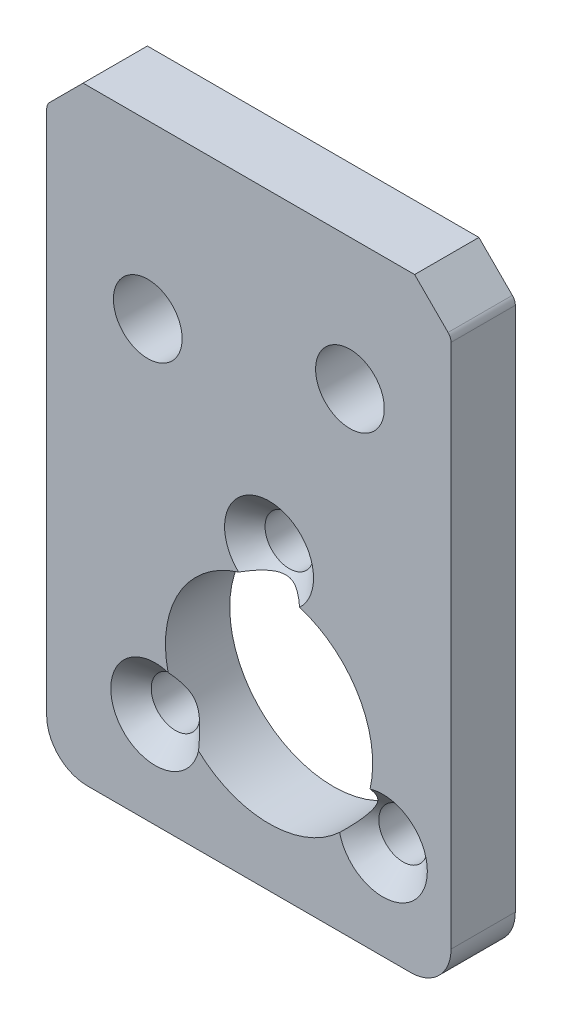
ISO-10303-21;
HEADER;
FILE_DESCRIPTION(('STEP AP214'),'2;1');
FILE_NAME('part.step','',(''),(''),'','','');
FILE_SCHEMA(('AUTOMOTIVE_DESIGN { 1 0 10303 214 1 1 1 1 }'));
ENDSEC;
DATA;
#1=APPLICATION_CONTEXT('core data for automotive mechanical design processes');
#2=APPLICATION_PROTOCOL_DEFINITION('international standard','automotive_design',2000,#1);
#3=PRODUCT_CONTEXT('',#1,'mechanical');
#4=PRODUCT('Part','Part','',(#3));
#5=PRODUCT_RELATED_PRODUCT_CATEGORY('part','',(#4));
#6=PRODUCT_DEFINITION_FORMATION('','',#4);
#7=PRODUCT_DEFINITION_CONTEXT('part definition',#1,'design');
#8=PRODUCT_DEFINITION('design','',#6,#7);
#9=PRODUCT_DEFINITION_SHAPE('','',#8);
#10=(LENGTH_UNIT() NAMED_UNIT(*) SI_UNIT(.MILLI.,.METRE.));
#11=(NAMED_UNIT(*) PLANE_ANGLE_UNIT() SI_UNIT($,.RADIAN.));
#12=(NAMED_UNIT(*) SI_UNIT($,.STERADIAN.) SOLID_ANGLE_UNIT());
#13=UNCERTAINTY_MEASURE_WITH_UNIT(LENGTH_MEASURE(1.E-05),#10,'distance_accuracy_value','');
#14=(GEOMETRIC_REPRESENTATION_CONTEXT(3) GLOBAL_UNCERTAINTY_ASSIGNED_CONTEXT((#13)) GLOBAL_UNIT_ASSIGNED_CONTEXT((#10,
#11,#12)) REPRESENTATION_CONTEXT('',''));
#15=CARTESIAN_POINT('',(0.,0.,0.));
#16=DIRECTION('',(0.,0.,1.));
#17=DIRECTION('',(1.,0.,0.));
#18=AXIS2_PLACEMENT_3D('',#15,#16,#17);
#19=CARTESIAN_POINT('',(0.,0.,3.18));
#20=DIRECTION('',(0.,0.,-1.));
#21=DIRECTION('',(-1.,0.,0.));
#22=AXIS2_PLACEMENT_3D('',#19,#20,#21);
#23=PLANE('',#22);
#24=DIRECTION('',(0.,-1.,0.));
#25=VECTOR('',#24,1.);
#26=CARTESIAN_POINT('',(-20.,-30.,3.18));
#27=LINE('',#26,#25);
#28=CARTESIAN_POINT('',(-20.,-2.00710678118655,3.18));
#29=VERTEX_POINT('',#28);
#30=CARTESIAN_POINT('',(-20.,-28.,3.18));
#31=VERTEX_POINT('',#30);
#32=EDGE_CURVE('E205',#29,#31,#27,.T.);
#33=ORIENTED_EDGE('',*,*,#32,.T.);
#34=CARTESIAN_POINT('',(-18.,-28.,3.18));
#35=DIRECTION('',(0.,0.,-1.));
#36=DIRECTION('',(-1.,0.,0.));
#37=AXIS2_PLACEMENT_3D('',#34,#35,#36);
#38=CIRCLE('',#37,2.);
#39=CARTESIAN_POINT('',(-18.,-30.,3.18));
#40=VERTEX_POINT('',#39);
#41=EDGE_CURVE('E54',#31,#40,#38,.F.);
#42=ORIENTED_EDGE('',*,*,#41,.T.);
#43=DIRECTION('',(1.,0.,0.));
#44=VECTOR('',#43,1.);
#45=CARTESIAN_POINT('',(-20.,-30.,3.18));
#46=LINE('',#45,#44);
#47=CARTESIAN_POINT('',(-2.,-30.,3.18));
#48=VERTEX_POINT('',#47);
#49=EDGE_CURVE('E208',#40,#48,#46,.T.);
#50=ORIENTED_EDGE('',*,*,#49,.T.);
#51=CARTESIAN_POINT('',(-2.,-28.,3.18));
#52=DIRECTION('',(0.,0.,-1.));
#53=DIRECTION('',(-1.,0.,0.));
#54=AXIS2_PLACEMENT_3D('',#51,#52,#53);
#55=CIRCLE('',#54,2.);
#56=CARTESIAN_POINT('',(0.,-28.,3.18));
#57=VERTEX_POINT('',#56);
#58=EDGE_CURVE('E61',#48,#57,#55,.F.);
#59=ORIENTED_EDGE('',*,*,#58,.T.);
#60=DIRECTION('',(0.,1.,0.));
#61=VECTOR('',#60,1.);
#62=CARTESIAN_POINT('',(0.,-30.,3.18));
#63=LINE('',#62,#61);
#64=CARTESIAN_POINT('',(0.,-2.00710678118655,3.18));
#65=VERTEX_POINT('',#64);
#66=EDGE_CURVE('E212',#57,#65,#63,.T.);
#67=ORIENTED_EDGE('',*,*,#66,.T.);
#68=CARTESIAN_POINT('',(-0.5,-2.00710678118655,3.18));
#69=DIRECTION('',(0.,0.,-1.));
#70=DIRECTION('',(-1.,0.,0.));
#71=AXIS2_PLACEMENT_3D('',#68,#69,#70);
#72=CIRCLE('',#71,0.5);
#73=CARTESIAN_POINT('',(-0.146446609406726,-1.65355339059328,3.18));
#74=VERTEX_POINT('',#73);
#75=EDGE_CURVE('E349',#65,#74,#72,.F.);
#76=ORIENTED_EDGE('',*,*,#75,.T.);
#77=DIRECTION('',(0.707106781186548,-0.707106781186548,0.));
#78=VECTOR('',#77,1.);
#79=CARTESIAN_POINT('',(-1.8,0.,3.18));
#80=LINE('',#79,#78);
#81=CARTESIAN_POINT('',(-1.8,0.,3.18));
#82=VERTEX_POINT('',#81);
#83=EDGE_CURVE('E370',#74,#82,#80,.F.);
#84=ORIENTED_EDGE('',*,*,#83,.T.);
#85=DIRECTION('',(-1.,0.,0.));
#86=VECTOR('',#85,1.);
#87=CARTESIAN_POINT('',(-20.,0.,3.18));
#88=LINE('',#87,#86);
#89=CARTESIAN_POINT('',(-18.2,0.,3.18));
#90=VERTEX_POINT('',#89);
#91=EDGE_CURVE('E215',#82,#90,#88,.T.);
#92=ORIENTED_EDGE('',*,*,#91,.T.);
#93=DIRECTION('',(0.707106781186546,0.707106781186549,0.));
#94=VECTOR('',#93,1.);
#95=CARTESIAN_POINT('',(-20.,-1.80000000000001,3.18));
#96=LINE('',#95,#94);
#97=CARTESIAN_POINT('',(-19.8535533905933,-1.65355339059328,3.18));
#98=VERTEX_POINT('',#97);
#99=EDGE_CURVE('E366',#90,#98,#96,.F.);
#100=ORIENTED_EDGE('',*,*,#99,.T.);
#101=CARTESIAN_POINT('',(-19.5,-2.00710678118655,3.18));
#102=DIRECTION('',(0.,0.,-1.));
#103=DIRECTION('',(-1.,0.,0.));
#104=AXIS2_PLACEMENT_3D('',#101,#102,#103);
#105=CIRCLE('',#104,0.5);
#106=EDGE_CURVE('E346',#98,#29,#105,.F.);
#107=ORIENTED_EDGE('',*,*,#106,.T.);
#108=EDGE_LOOP('',(#33,#42,#50,#59,#67,#76,#84,#92,#100,#107));
#109=FACE_BOUND('',#108,.T.);
#110=CARTESIAN_POINT('',(-5.,-6.5,3.18));
#111=DIRECTION('',(0.,0.,1.));
#112=DIRECTION('',(1.,0.,0.));
#113=AXIS2_PLACEMENT_3D('',#110,#111,#112);
#114=CIRCLE('',#113,1.7);
#115=CARTESIAN_POINT('',(-6.7,-6.5,3.18));
#116=VERTEX_POINT('',#115);
#117=EDGE_CURVE('E197',#116,#116,#114,.T.);
#118=ORIENTED_EDGE('',*,*,#117,.F.);
#119=EDGE_LOOP('',(#118));
#120=FACE_BOUND('',#119,.T.);
#121=CARTESIAN_POINT('',(-15.,-8.5,3.18));
#122=DIRECTION('',(0.,0.,1.));
#123=DIRECTION('',(1.,0.,0.));
#124=AXIS2_PLACEMENT_3D('',#121,#122,#123);
#125=CIRCLE('',#124,1.7);
#126=CARTESIAN_POINT('',(-16.7,-8.5,3.18));
#127=VERTEX_POINT('',#126);
#128=EDGE_CURVE('E176',#127,#127,#125,.T.);
#129=ORIENTED_EDGE('',*,*,#128,.F.);
#130=EDGE_LOOP('',(#129));
#131=FACE_BOUND('',#130,.T.);
#132=CARTESIAN_POINT('',(-9.,-22.,3.18));
#133=DIRECTION('',(0.,0.,1.));
#134=DIRECTION('',(1.,0.,0.));
#135=AXIS2_PLACEMENT_3D('',#132,#133,#134);
#136=CIRCLE('',#135,5.125);
#137=CARTESIAN_POINT('',(-10.5079776140165,-17.101875,3.18));
#138=VERTEX_POINT('',#137);
#139=CARTESIAN_POINT('',(-13.9958894879199,-23.1431155779234,3.18));
#140=VERTEX_POINT('',#139);
#141=EDGE_CURVE('E160',#138,#140,#136,.T.);
#142=ORIENTED_EDGE('',*,*,#141,.F.);
#143=CARTESIAN_POINT('',(-9.,-15.5,3.18));
#144=DIRECTION('',(0.,0.,1.));
#145=DIRECTION('',(1.,0.,0.));
#146=AXIS2_PLACEMENT_3D('',#143,#144,#145);
#147=CIRCLE('',#146,2.2);
#148=CARTESIAN_POINT('',(-7.49202238598347,-17.101875,3.18));
#149=VERTEX_POINT('',#148);
#150=EDGE_CURVE('E147',#149,#138,#147,.T.);
#151=ORIENTED_EDGE('',*,*,#150,.F.);
#152=CARTESIAN_POINT('',(-4.00411051208008,-23.1431155779234,3.18));
#153=VERTEX_POINT('',#152);
#154=EDGE_CURVE('E158',#153,#149,#136,.T.);
#155=ORIENTED_EDGE('',*,*,#154,.F.);
#156=CARTESIAN_POINT('',(-3.37083487540115,-25.25,3.18));
#157=DIRECTION('',(0.,0.,1.));
#158=DIRECTION('',(1.,0.,0.));
#159=AXIS2_PLACEMENT_3D('',#156,#157,#158);
#160=CIRCLE('',#159,2.2);
#161=CARTESIAN_POINT('',(-5.51208812609661,-25.7550094220766,3.18));
#162=VERTEX_POINT('',#161);
#163=EDGE_CURVE('E417',#162,#153,#160,.T.);
#164=ORIENTED_EDGE('',*,*,#163,.F.);
#165=CARTESIAN_POINT('',(-12.4879118739034,-25.7550094220766,3.18));
#166=VERTEX_POINT('',#165);
#167=EDGE_CURVE('E172',#166,#162,#136,.T.);
#168=ORIENTED_EDGE('',*,*,#167,.F.);
#169=CARTESIAN_POINT('',(-14.6291651245988,-25.25,3.18));
#170=DIRECTION('',(0.,0.,1.));
#171=DIRECTION('',(1.,0.,0.));
#172=AXIS2_PLACEMENT_3D('',#169,#170,#171);
#173=CIRCLE('',#172,2.2);
#174=EDGE_CURVE('E412',#140,#166,#173,.T.);
#175=ORIENTED_EDGE('',*,*,#174,.F.);
#176=EDGE_LOOP('',(#142,#151,#155,#164,#168,#175));
#177=FACE_BOUND('',#176,.T.);
#178=ADVANCED_FACE('F45',(#109,#120,#131,#177),#23,.F.);
#179=CARTESIAN_POINT('',(0.,0.,0.));
#180=DIRECTION('',(0.,0.,-1.));
#181=DIRECTION('',(-1.,0.,0.));
#182=AXIS2_PLACEMENT_3D('',#179,#180,#181);
#183=PLANE('',#182);
#184=CARTESIAN_POINT('',(-9.,-15.5,0.));
#185=DIRECTION('',(0.,0.,1.));
#186=DIRECTION('',(1.,0.,0.));
#187=AXIS2_PLACEMENT_3D('',#184,#185,#186);
#188=CIRCLE('',#187,1.2);
#189=CARTESIAN_POINT('',(-7.8,-15.5,0.));
#190=VERTEX_POINT('',#189);
#191=EDGE_CURVE('E419',#190,#190,#188,.T.);
#192=ORIENTED_EDGE('',*,*,#191,.T.);
#193=EDGE_LOOP('',(#192));
#194=FACE_BOUND('',#193,.T.);
#195=CARTESIAN_POINT('',(-14.6291651245988,-25.25,0.));
#196=DIRECTION('',(0.,0.,1.));
#197=DIRECTION('',(1.,0.,0.));
#198=AXIS2_PLACEMENT_3D('',#195,#196,#197);
#199=CIRCLE('',#198,1.2);
#200=CARTESIAN_POINT('',(-13.4291651245988,-25.25,0.));
#201=VERTEX_POINT('',#200);
#202=EDGE_CURVE('E411',#201,#201,#199,.T.);
#203=ORIENTED_EDGE('',*,*,#202,.T.);
#204=EDGE_LOOP('',(#203));
#205=FACE_BOUND('',#204,.T.);
#206=CARTESIAN_POINT('',(-3.37083487540115,-25.25,0.));
#207=DIRECTION('',(0.,0.,1.));
#208=DIRECTION('',(1.,0.,0.));
#209=AXIS2_PLACEMENT_3D('',#206,#207,#208);
#210=CIRCLE('',#209,1.2);
#211=CARTESIAN_POINT('',(-2.17083487540115,-25.25,0.));
#212=VERTEX_POINT('',#211);
#213=EDGE_CURVE('E186',#212,#212,#210,.T.);
#214=ORIENTED_EDGE('',*,*,#213,.T.);
#215=EDGE_LOOP('',(#214));
#216=FACE_BOUND('',#215,.T.);
#217=CARTESIAN_POINT('',(-15.,-8.5,0.));
#218=DIRECTION('',(0.,0.,1.));
#219=DIRECTION('',(1.,0.,0.));
#220=AXIS2_PLACEMENT_3D('',#217,#218,#219);
#221=CIRCLE('',#220,1.7);
#222=CARTESIAN_POINT('',(-16.7,-8.5,0.));
#223=VERTEX_POINT('',#222);
#224=EDGE_CURVE('E170',#223,#223,#221,.T.);
#225=ORIENTED_EDGE('',*,*,#224,.T.);
#226=EDGE_LOOP('',(#225));
#227=FACE_BOUND('',#226,.T.);
#228=DIRECTION('',(1.,0.,0.));
#229=VECTOR('',#228,1.);
#230=CARTESIAN_POINT('',(-20.,-30.,0.));
#231=LINE('',#230,#229);
#232=CARTESIAN_POINT('',(-18.,-30.,0.));
#233=VERTEX_POINT('',#232);
#234=CARTESIAN_POINT('',(-2.,-30.,0.));
#235=VERTEX_POINT('',#234);
#236=EDGE_CURVE('E221',#233,#235,#231,.T.);
#237=ORIENTED_EDGE('',*,*,#236,.F.);
#238=CARTESIAN_POINT('',(-18.,-28.,0.));
#239=DIRECTION('',(0.,0.,-1.));
#240=DIRECTION('',(-1.,0.,0.));
#241=AXIS2_PLACEMENT_3D('',#238,#239,#240);
#242=CIRCLE('',#241,2.);
#243=CARTESIAN_POINT('',(-20.,-28.,0.));
#244=VERTEX_POINT('',#243);
#245=EDGE_CURVE('E328',#233,#244,#242,.T.);
#246=ORIENTED_EDGE('',*,*,#245,.T.);
#247=DIRECTION('',(0.,-1.,0.));
#248=VECTOR('',#247,1.);
#249=CARTESIAN_POINT('',(-20.,-30.,0.));
#250=LINE('',#249,#248);
#251=CARTESIAN_POINT('',(-20.,-2.00710678118655,0.));
#252=VERTEX_POINT('',#251);
#253=EDGE_CURVE('E201',#252,#244,#250,.T.);
#254=ORIENTED_EDGE('',*,*,#253,.F.);
#255=CARTESIAN_POINT('',(-19.5,-2.00710678118655,0.));
#256=DIRECTION('',(0.,0.,-1.));
#257=DIRECTION('',(-1.,0.,0.));
#258=AXIS2_PLACEMENT_3D('',#255,#256,#257);
#259=CIRCLE('',#258,0.5);
#260=CARTESIAN_POINT('',(-19.8535533905933,-1.65355339059328,0.));
#261=VERTEX_POINT('',#260);
#262=EDGE_CURVE('E355',#252,#261,#259,.T.);
#263=ORIENTED_EDGE('',*,*,#262,.T.);
#264=DIRECTION('',(-0.707106781186546,-0.707106781186549,0.));
#265=VECTOR('',#264,1.);
#266=CARTESIAN_POINT('',(-9.10000000000004,9.1,0.));
#267=LINE('',#266,#265);
#268=CARTESIAN_POINT('',(-18.2,0.,0.));
#269=VERTEX_POINT('',#268);
#270=EDGE_CURVE('E380',#261,#269,#267,.F.);
#271=ORIENTED_EDGE('',*,*,#270,.T.);
#272=DIRECTION('',(-1.,0.,0.));
#273=VECTOR('',#272,1.);
#274=CARTESIAN_POINT('',(-20.,0.,0.));
#275=LINE('',#274,#273);
#276=CARTESIAN_POINT('',(-1.8,0.,0.));
#277=VERTEX_POINT('',#276);
#278=EDGE_CURVE('E209',#277,#269,#275,.T.);
#279=ORIENTED_EDGE('',*,*,#278,.F.);
#280=DIRECTION('',(-0.707106781186548,0.707106781186548,0.));
#281=VECTOR('',#280,1.);
#282=CARTESIAN_POINT('',(-0.900000000000001,-0.900000000000001,0.));
#283=LINE('',#282,#281);
#284=CARTESIAN_POINT('',(-0.146446609406726,-1.65355339059328,0.));
#285=VERTEX_POINT('',#284);
#286=EDGE_CURVE('E152',#277,#285,#283,.F.);
#287=ORIENTED_EDGE('',*,*,#286,.T.);
#288=CARTESIAN_POINT('',(-0.5,-2.00710678118655,0.));
#289=DIRECTION('',(0.,0.,-1.));
#290=DIRECTION('',(-1.,0.,0.));
#291=AXIS2_PLACEMENT_3D('',#288,#289,#290);
#292=CIRCLE('',#291,0.5);
#293=CARTESIAN_POINT('',(0.,-2.00710678118655,0.));
#294=VERTEX_POINT('',#293);
#295=EDGE_CURVE('E358',#285,#294,#292,.T.);
#296=ORIENTED_EDGE('',*,*,#295,.T.);
#297=DIRECTION('',(0.,1.,0.));
#298=VECTOR('',#297,1.);
#299=CARTESIAN_POINT('',(0.,-30.,0.));
#300=LINE('',#299,#298);
#301=CARTESIAN_POINT('',(0.,-28.,0.));
#302=VERTEX_POINT('',#301);
#303=EDGE_CURVE('E225',#302,#294,#300,.T.);
#304=ORIENTED_EDGE('',*,*,#303,.F.);
#305=CARTESIAN_POINT('',(-2.,-28.,0.));
#306=DIRECTION('',(0.,0.,-1.));
#307=DIRECTION('',(-1.,0.,0.));
#308=AXIS2_PLACEMENT_3D('',#305,#306,#307);
#309=CIRCLE('',#308,2.);
#310=EDGE_CURVE('E331',#302,#235,#309,.T.);
#311=ORIENTED_EDGE('',*,*,#310,.T.);
#312=EDGE_LOOP('',(#237,#246,#254,#263,#271,#279,#287,#296,#304,#311));
#313=FACE_BOUND('',#312,.T.);
#314=CARTESIAN_POINT('',(-5.,-6.5,0.));
#315=DIRECTION('',(0.,0.,1.));
#316=DIRECTION('',(1.,0.,0.));
#317=AXIS2_PLACEMENT_3D('',#314,#315,#316);
#318=CIRCLE('',#317,1.7);
#319=CARTESIAN_POINT('',(-6.7,-6.5,0.));
#320=VERTEX_POINT('',#319);
#321=EDGE_CURVE('E195',#320,#320,#318,.T.);
#322=ORIENTED_EDGE('',*,*,#321,.T.);
#323=EDGE_LOOP('',(#322));
#324=FACE_BOUND('',#323,.T.);
#325=CARTESIAN_POINT('',(-9.,-22.,0.));
#326=DIRECTION('',(0.,0.,1.));
#327=DIRECTION('',(1.,0.,0.));
#328=AXIS2_PLACEMENT_3D('',#325,#326,#327);
#329=CIRCLE('',#328,5.125);
#330=CARTESIAN_POINT('',(-3.875,-22.,0.));
#331=VERTEX_POINT('',#330);
#332=EDGE_CURVE('E181',#331,#331,#329,.T.);
#333=ORIENTED_EDGE('',*,*,#332,.T.);
#334=EDGE_LOOP('',(#333));
#335=FACE_BOUND('',#334,.T.);
#336=ADVANCED_FACE('F263',(#194,#205,#216,#227,#313,#324,#335),#183,.T.);
#337=CARTESIAN_POINT('',(-20.,-30.,3.18));
#338=DIRECTION('',(1.,0.,0.));
#339=DIRECTION('',(0.,0.,-1.));
#340=AXIS2_PLACEMENT_3D('',#337,#338,#339);
#341=PLANE('',#340);
#342=ORIENTED_EDGE('',*,*,#253,.T.);
#343=DIRECTION('',(0.,0.,-1.));
#344=VECTOR('',#343,1.);
#345=CARTESIAN_POINT('',(-20.,-28.,3.18));
#346=LINE('',#345,#344);
#347=EDGE_CURVE('E69',#244,#31,#346,.F.);
#348=ORIENTED_EDGE('',*,*,#347,.T.);
#349=ORIENTED_EDGE('',*,*,#32,.F.);
#350=DIRECTION('',(0.,0.,1.));
#351=VECTOR('',#350,1.);
#352=CARTESIAN_POINT('',(-20.,-2.00710678118655,0.));
#353=LINE('',#352,#351);
#354=EDGE_CURVE('E362',#29,#252,#353,.F.);
#355=ORIENTED_EDGE('',*,*,#354,.T.);
#356=EDGE_LOOP('',(#342,#348,#349,#355));
#357=FACE_BOUND('',#356,.T.);
#358=ADVANCED_FACE('F268',(#357),#341,.F.);
#359=CARTESIAN_POINT('',(-20.,-30.,3.18));
#360=DIRECTION('',(0.,1.,0.));
#361=DIRECTION('',(0.,0.,1.));
#362=AXIS2_PLACEMENT_3D('',#359,#360,#361);
#363=PLANE('',#362);
#364=ORIENTED_EDGE('',*,*,#49,.F.);
#365=DIRECTION('',(0.,0.,-1.));
#366=VECTOR('',#365,1.);
#367=CARTESIAN_POINT('',(-18.,-30.,3.18));
#368=LINE('',#367,#366);
#369=EDGE_CURVE('E320',#40,#233,#368,.T.);
#370=ORIENTED_EDGE('',*,*,#369,.T.);
#371=ORIENTED_EDGE('',*,*,#236,.T.);
#372=DIRECTION('',(0.,0.,-1.));
#373=VECTOR('',#372,1.);
#374=CARTESIAN_POINT('',(-2.,-30.,3.18));
#375=LINE('',#374,#373);
#376=EDGE_CURVE('E336',#235,#48,#375,.F.);
#377=ORIENTED_EDGE('',*,*,#376,.T.);
#378=EDGE_LOOP('',(#364,#370,#371,#377));
#379=FACE_BOUND('',#378,.T.);
#380=ADVANCED_FACE('F282',(#379),#363,.F.);
#381=CARTESIAN_POINT('',(0.,-30.,3.18));
#382=DIRECTION('',(-1.,0.,0.));
#383=DIRECTION('',(0.,0.,1.));
#384=AXIS2_PLACEMENT_3D('',#381,#382,#383);
#385=PLANE('',#384);
#386=ORIENTED_EDGE('',*,*,#66,.F.);
#387=DIRECTION('',(0.,0.,-1.));
#388=VECTOR('',#387,1.);
#389=CARTESIAN_POINT('',(0.,-28.,3.18));
#390=LINE('',#389,#388);
#391=EDGE_CURVE('E11',#57,#302,#390,.T.);
#392=ORIENTED_EDGE('',*,*,#391,.T.);
#393=ORIENTED_EDGE('',*,*,#303,.T.);
#394=DIRECTION('',(0.,0.,-1.));
#395=VECTOR('',#394,1.);
#396=CARTESIAN_POINT('',(0.,-2.00710678118655,3.18));
#397=LINE('',#396,#395);
#398=EDGE_CURVE('E342',#294,#65,#397,.F.);
#399=ORIENTED_EDGE('',*,*,#398,.T.);
#400=EDGE_LOOP('',(#386,#392,#393,#399));
#401=FACE_BOUND('',#400,.T.);
#402=ADVANCED_FACE('F278',(#401),#385,.F.);
#403=CARTESIAN_POINT('',(-20.,0.,3.18));
#404=DIRECTION('',(0.,-1.,0.));
#405=DIRECTION('',(0.,0.,-1.));
#406=AXIS2_PLACEMENT_3D('',#403,#404,#405);
#407=PLANE('',#406);
#408=ORIENTED_EDGE('',*,*,#278,.T.);
#409=DIRECTION('',(0.,0.,1.));
#410=VECTOR('',#409,1.);
#411=CARTESIAN_POINT('',(-18.2,0.,3.18));
#412=LINE('',#411,#410);
#413=EDGE_CURVE('E373',#269,#90,#412,.T.);
#414=ORIENTED_EDGE('',*,*,#413,.T.);
#415=ORIENTED_EDGE('',*,*,#91,.F.);
#416=DIRECTION('',(0.,0.,-1.));
#417=VECTOR('',#416,1.);
#418=CARTESIAN_POINT('',(-1.8,0.,3.18));
#419=LINE('',#418,#417);
#420=EDGE_CURVE('E376',#82,#277,#419,.T.);
#421=ORIENTED_EDGE('',*,*,#420,.T.);
#422=EDGE_LOOP('',(#408,#414,#415,#421));
#423=FACE_BOUND('',#422,.T.);
#424=ADVANCED_FACE('F275',(#423),#407,.F.);
#425=CARTESIAN_POINT('',(-5.,-6.5,3.18));
#426=DIRECTION('',(0.,0.,-1.));
#427=DIRECTION('',(-1.,0.,0.));
#428=AXIS2_PLACEMENT_3D('',#425,#426,#427);
#429=CYLINDRICAL_SURFACE('',#428,1.7);
#430=CARTESIAN_POINT('',(-6.7,-6.5,3.18));
#431=CARTESIAN_POINT('',(-6.7,-6.5,3.146875));
#432=CARTESIAN_POINT('',(-6.7,-6.5,3.11375));
#433=CARTESIAN_POINT('',(-6.7,-6.5,3.0475));
#434=CARTESIAN_POINT('',(-6.7,-6.5,3.014375));
#435=CARTESIAN_POINT('',(-6.7,-6.5,2.948125));
#436=CARTESIAN_POINT('',(-6.7,-6.5,2.915));
#437=CARTESIAN_POINT('',(-6.7,-6.5,2.84875));
#438=CARTESIAN_POINT('',(-6.7,-6.5,2.815625));
#439=CARTESIAN_POINT('',(-6.7,-6.5,2.749375));
#440=CARTESIAN_POINT('',(-6.7,-6.5,2.71625));
#441=CARTESIAN_POINT('',(-6.7,-6.5,2.65));
#442=CARTESIAN_POINT('',(-6.7,-6.5,2.616875));
#443=CARTESIAN_POINT('',(-6.7,-6.5,2.550625));
#444=CARTESIAN_POINT('',(-6.7,-6.5,2.5175));
#445=CARTESIAN_POINT('',(-6.7,-6.5,2.45125));
#446=CARTESIAN_POINT('',(-6.7,-6.5,2.418125));
#447=CARTESIAN_POINT('',(-6.7,-6.5,2.351875));
#448=CARTESIAN_POINT('',(-6.7,-6.5,2.31875));
#449=CARTESIAN_POINT('',(-6.7,-6.5,2.2525));
#450=CARTESIAN_POINT('',(-6.7,-6.5,2.219375));
#451=CARTESIAN_POINT('',(-6.7,-6.5,2.153125));
#452=CARTESIAN_POINT('',(-6.7,-6.5,2.12));
#453=CARTESIAN_POINT('',(-6.7,-6.5,2.05375));
#454=CARTESIAN_POINT('',(-6.7,-6.5,2.020625));
#455=CARTESIAN_POINT('',(-6.7,-6.5,1.954375));
#456=CARTESIAN_POINT('',(-6.7,-6.5,1.92125));
#457=CARTESIAN_POINT('',(-6.7,-6.5,1.855));
#458=CARTESIAN_POINT('',(-6.7,-6.5,1.821875));
#459=CARTESIAN_POINT('',(-6.7,-6.5,1.755625));
#460=CARTESIAN_POINT('',(-6.7,-6.5,1.7225));
#461=CARTESIAN_POINT('',(-6.7,-6.5,1.65625));
#462=CARTESIAN_POINT('',(-6.7,-6.5,1.623125));
#463=CARTESIAN_POINT('',(-6.7,-6.5,1.556875));
#464=CARTESIAN_POINT('',(-6.7,-6.5,1.52375));
#465=CARTESIAN_POINT('',(-6.7,-6.5,1.4575));
#466=CARTESIAN_POINT('',(-6.7,-6.5,1.424375));
#467=CARTESIAN_POINT('',(-6.7,-6.5,1.358125));
#468=CARTESIAN_POINT('',(-6.7,-6.5,1.325));
#469=CARTESIAN_POINT('',(-6.7,-6.5,1.25875));
#470=CARTESIAN_POINT('',(-6.7,-6.5,1.225625));
#471=CARTESIAN_POINT('',(-6.7,-6.5,1.159375));
#472=CARTESIAN_POINT('',(-6.7,-6.5,1.12625));
#473=CARTESIAN_POINT('',(-6.7,-6.5,1.06));
#474=CARTESIAN_POINT('',(-6.7,-6.5,1.026875));
#475=CARTESIAN_POINT('',(-6.7,-6.5,0.960625));
#476=CARTESIAN_POINT('',(-6.7,-6.5,0.9275));
#477=CARTESIAN_POINT('',(-6.7,-6.5,0.86125));
#478=CARTESIAN_POINT('',(-6.7,-6.5,0.828125));
#479=CARTESIAN_POINT('',(-6.7,-6.5,0.761875));
#480=CARTESIAN_POINT('',(-6.7,-6.5,0.72875));
#481=CARTESIAN_POINT('',(-6.7,-6.5,0.6625));
#482=CARTESIAN_POINT('',(-6.7,-6.5,0.629375));
#483=CARTESIAN_POINT('',(-6.7,-6.5,0.563125));
#484=CARTESIAN_POINT('',(-6.7,-6.5,0.53));
#485=CARTESIAN_POINT('',(-6.7,-6.5,0.46375));
#486=CARTESIAN_POINT('',(-6.7,-6.5,0.430625));
#487=CARTESIAN_POINT('',(-6.7,-6.5,0.364375));
#488=CARTESIAN_POINT('',(-6.7,-6.5,0.33125));
#489=CARTESIAN_POINT('',(-6.7,-6.5,0.265));
#490=CARTESIAN_POINT('',(-6.7,-6.5,0.231875));
#491=CARTESIAN_POINT('',(-6.7,-6.5,0.165625));
#492=CARTESIAN_POINT('',(-6.7,-6.5,0.1325));
#493=CARTESIAN_POINT('',(-6.7,-6.5,0.06625));
#494=CARTESIAN_POINT('',(-6.7,-6.5,0.033125));
#495=CARTESIAN_POINT('',(-6.7,-6.5,0.));
#496=B_SPLINE_CURVE_WITH_KNOTS('',3,(#430,#431,#432,#433,#434,#435,#436,#437,#438,#439,#440,
#441,#442,#443,#444,#445,#446,#447,#448,#449,#450,#451,#452,#453,#454,#455,#456,#457,#458,#459,
#460,#461,#462,#463,#464,#465,#466,#467,#468,#469,#470,#471,#472,#473,#474,#475,#476,#477,#478,
#479,#480,#481,#482,#483,#484,#485,#486,#487,#488,#489,#490,#491,#492,#493,#494,#495),
.UNSPECIFIED.,.F.,.F.,(4,2,2,2,2,2,2,2,2,2,2,2,2,2,2,2,2,2,2,2,2,2,2,2,2,2,2,2,2,2,2,2,4),(0.,
0.0993750000000001,0.19875,0.298125,0.3975,0.496875,0.59625,0.695625,0.795,0.894375,0.99375,
1.093125,1.1925,1.291875,1.39125,1.490625,1.59,1.689375,1.78875,1.888125,1.9875,2.086875,
2.18625,2.285625,2.385,2.484375,2.58375,2.683125,2.7825,2.881875,2.98125,3.080625,3.18),.UNSPECIFIED.);
#497=EDGE_CURVE('BSEAM273',#116,#320,#496,.T.);
#498=ORIENTED_EDGE('',*,*,#117,.T.);
#499=ORIENTED_EDGE('',*,*,#321,.F.);
#500=ORIENTED_EDGE('',*,*,#497,.T.);
#501=ORIENTED_EDGE('',*,*,#497,.F.);
#502=EDGE_LOOP('',(#498,#500,#499,#501));
#503=FACE_BOUND('',#502,.T.);
#504=ADVANCED_FACE('F273',(#503),#429,.F.);
#505=CARTESIAN_POINT('',(-15.,-8.5,3.18));
#506=DIRECTION('',(0.,0.,-1.));
#507=DIRECTION('',(-1.,0.,0.));
#508=AXIS2_PLACEMENT_3D('',#505,#506,#507);
#509=CYLINDRICAL_SURFACE('',#508,1.7);
#510=CARTESIAN_POINT('',(-16.7,-8.5,3.18));
#511=CARTESIAN_POINT('',(-16.7,-8.5,3.146875));
#512=CARTESIAN_POINT('',(-16.7,-8.5,3.11375));
#513=CARTESIAN_POINT('',(-16.7,-8.5,3.0475));
#514=CARTESIAN_POINT('',(-16.7,-8.5,3.014375));
#515=CARTESIAN_POINT('',(-16.7,-8.5,2.948125));
#516=CARTESIAN_POINT('',(-16.7,-8.5,2.915));
#517=CARTESIAN_POINT('',(-16.7,-8.5,2.84875));
#518=CARTESIAN_POINT('',(-16.7,-8.5,2.815625));
#519=CARTESIAN_POINT('',(-16.7,-8.5,2.749375));
#520=CARTESIAN_POINT('',(-16.7,-8.5,2.71625));
#521=CARTESIAN_POINT('',(-16.7,-8.5,2.65));
#522=CARTESIAN_POINT('',(-16.7,-8.5,2.616875));
#523=CARTESIAN_POINT('',(-16.7,-8.5,2.550625));
#524=CARTESIAN_POINT('',(-16.7,-8.5,2.5175));
#525=CARTESIAN_POINT('',(-16.7,-8.5,2.45125));
#526=CARTESIAN_POINT('',(-16.7,-8.5,2.418125));
#527=CARTESIAN_POINT('',(-16.7,-8.5,2.351875));
#528=CARTESIAN_POINT('',(-16.7,-8.5,2.31875));
#529=CARTESIAN_POINT('',(-16.7,-8.5,2.2525));
#530=CARTESIAN_POINT('',(-16.7,-8.5,2.219375));
#531=CARTESIAN_POINT('',(-16.7,-8.5,2.153125));
#532=CARTESIAN_POINT('',(-16.7,-8.5,2.12));
#533=CARTESIAN_POINT('',(-16.7,-8.5,2.05375));
#534=CARTESIAN_POINT('',(-16.7,-8.5,2.020625));
#535=CARTESIAN_POINT('',(-16.7,-8.5,1.954375));
#536=CARTESIAN_POINT('',(-16.7,-8.5,1.92125));
#537=CARTESIAN_POINT('',(-16.7,-8.5,1.855));
#538=CARTESIAN_POINT('',(-16.7,-8.5,1.821875));
#539=CARTESIAN_POINT('',(-16.7,-8.5,1.755625));
#540=CARTESIAN_POINT('',(-16.7,-8.5,1.7225));
#541=CARTESIAN_POINT('',(-16.7,-8.5,1.65625));
#542=CARTESIAN_POINT('',(-16.7,-8.5,1.623125));
#543=CARTESIAN_POINT('',(-16.7,-8.5,1.556875));
#544=CARTESIAN_POINT('',(-16.7,-8.5,1.52375));
#545=CARTESIAN_POINT('',(-16.7,-8.5,1.4575));
#546=CARTESIAN_POINT('',(-16.7,-8.5,1.424375));
#547=CARTESIAN_POINT('',(-16.7,-8.5,1.358125));
#548=CARTESIAN_POINT('',(-16.7,-8.5,1.325));
#549=CARTESIAN_POINT('',(-16.7,-8.5,1.25875));
#550=CARTESIAN_POINT('',(-16.7,-8.5,1.225625));
#551=CARTESIAN_POINT('',(-16.7,-8.5,1.159375));
#552=CARTESIAN_POINT('',(-16.7,-8.5,1.12625));
#553=CARTESIAN_POINT('',(-16.7,-8.5,1.06));
#554=CARTESIAN_POINT('',(-16.7,-8.5,1.026875));
#555=CARTESIAN_POINT('',(-16.7,-8.5,0.960625));
#556=CARTESIAN_POINT('',(-16.7,-8.5,0.9275));
#557=CARTESIAN_POINT('',(-16.7,-8.5,0.86125));
#558=CARTESIAN_POINT('',(-16.7,-8.5,0.828125));
#559=CARTESIAN_POINT('',(-16.7,-8.5,0.761875));
#560=CARTESIAN_POINT('',(-16.7,-8.5,0.72875));
#561=CARTESIAN_POINT('',(-16.7,-8.5,0.6625));
#562=CARTESIAN_POINT('',(-16.7,-8.5,0.629375));
#563=CARTESIAN_POINT('',(-16.7,-8.5,0.563125));
#564=CARTESIAN_POINT('',(-16.7,-8.5,0.53));
#565=CARTESIAN_POINT('',(-16.7,-8.5,0.46375));
#566=CARTESIAN_POINT('',(-16.7,-8.5,0.430625));
#567=CARTESIAN_POINT('',(-16.7,-8.5,0.364375));
#568=CARTESIAN_POINT('',(-16.7,-8.5,0.33125));
#569=CARTESIAN_POINT('',(-16.7,-8.5,0.265));
#570=CARTESIAN_POINT('',(-16.7,-8.5,0.231875));
#571=CARTESIAN_POINT('',(-16.7,-8.5,0.165625));
#572=CARTESIAN_POINT('',(-16.7,-8.5,0.1325));
#573=CARTESIAN_POINT('',(-16.7,-8.5,0.06625));
#574=CARTESIAN_POINT('',(-16.7,-8.5,0.033125));
#575=CARTESIAN_POINT('',(-16.7,-8.5,0.));
#576=B_SPLINE_CURVE_WITH_KNOTS('',3,(#510,#511,#512,#513,#514,#515,#516,#517,#518,#519,#520,
#521,#522,#523,#524,#525,#526,#527,#528,#529,#530,#531,#532,#533,#534,#535,#536,#537,#538,#539,
#540,#541,#542,#543,#544,#545,#546,#547,#548,#549,#550,#551,#552,#553,#554,#555,#556,#557,#558,
#559,#560,#561,#562,#563,#564,#565,#566,#567,#568,#569,#570,#571,#572,#573,#574,#575),
.UNSPECIFIED.,.F.,.F.,(4,2,2,2,2,2,2,2,2,2,2,2,2,2,2,2,2,2,2,2,2,2,2,2,2,2,2,2,2,2,2,2,4),(0.,
0.0993750000000001,0.19875,0.298125,0.3975,0.496875,0.59625,0.695625,0.795,0.894375,0.99375,
1.093125,1.1925,1.291875,1.39125,1.490625,1.59,1.689375,1.78875,1.888125,1.9875,2.086875,
2.18625,2.285625,2.385,2.484375,2.58375,2.683125,2.7825,2.881875,2.98125,3.080625,3.18),.UNSPECIFIED.);
#577=EDGE_CURVE('BSEAM259',#127,#223,#576,.T.);
#578=ORIENTED_EDGE('',*,*,#128,.T.);
#579=ORIENTED_EDGE('',*,*,#224,.F.);
#580=ORIENTED_EDGE('',*,*,#577,.T.);
#581=ORIENTED_EDGE('',*,*,#577,.F.);
#582=EDGE_LOOP('',(#578,#580,#579,#581));
#583=FACE_BOUND('',#582,.T.);
#584=ADVANCED_FACE('F259',(#583),#509,.F.);
#585=CARTESIAN_POINT('',(-9.,-22.,3.18));
#586=DIRECTION('',(0.,0.,-1.));
#587=DIRECTION('',(-1.,0.,0.));
#588=AXIS2_PLACEMENT_3D('',#585,#586,#587);
#589=CYLINDRICAL_SURFACE('',#588,5.125);
#590=CARTESIAN_POINT('',(-10.5081974806715,-17.1019426953846,3.1802));
#591=CARTESIAN_POINT('',(-10.4708524754633,-17.0904453689759,3.14623834295344));
#592=CARTESIAN_POINT('',(-10.4331583393934,-17.0793044816368,3.11253417695848));
#593=CARTESIAN_POINT('',(-10.3569627080099,-17.0577484662825,3.04578413453123));
#594=CARTESIAN_POINT('',(-10.3184609174053,-17.0473336099515,3.01273850779557));
#595=CARTESIAN_POINT('',(-10.2399615381116,-17.0270946229878,2.94696577432319));
#596=CARTESIAN_POINT('',(-10.1999499890095,-17.0172822290771,2.91425165909249));
#597=CARTESIAN_POINT('',(-10.1188834776178,-16.9984545855424,2.8499114789038));
#598=CARTESIAN_POINT('',(-10.0778286450888,-16.9894392374027,2.81828527977443));
#599=CARTESIAN_POINT('',(-9.99090732737057,-16.9714948133508,2.75374909235705));
#600=CARTESIAN_POINT('',(-9.94493166897655,-16.9626405488186,2.72096442113631));
#601=CARTESIAN_POINT('',(-9.85127843974205,-16.9459705850833,2.65757173940937));
#602=CARTESIAN_POINT('',(-9.80360017208639,-16.9381553174287,2.62696463579691));
#603=CARTESIAN_POINT('',(-9.70659505591064,-16.9237082429592,2.56892050027748));
#604=CARTESIAN_POINT('',(-9.65728119486757,-16.9170689515242,2.54146384275624));
#605=CARTESIAN_POINT('',(-9.55648232497258,-16.905049238973,2.49059946304481));
#606=CARTESIAN_POINT('',(-9.50499987463822,-16.8996673808524,2.4671871270319));
#607=CARTESIAN_POINT('',(-9.4164010561397,-16.8918165294579,2.43239155374578));
#608=CARTESIAN_POINT('',(-9.37989554343218,-16.8889647437677,2.4195464661709));
#609=CARTESIAN_POINT('',(-9.30586307324589,-16.8840007337678,2.39695531314692));
#610=CARTESIAN_POINT('',(-9.26833588644761,-16.8818886769934,2.38720994977578));
#611=CARTESIAN_POINT('',(-9.19318027292429,-16.8785066737091,2.37150030811038));
#612=CARTESIAN_POINT('',(-9.15556677557786,-16.8772217623365,2.36546892853032));
#613=CARTESIAN_POINT('',(-9.07990308204774,-16.87548328013,2.35728895152603));
#614=CARTESIAN_POINT('',(-9.04185300667805,-16.8750294846311,2.35513930480418));
#615=CARTESIAN_POINT('',(-8.96532316083798,-16.8749730201875,2.35487253695967));
#616=CARTESIAN_POINT('',(-8.92684320290252,-16.8753796293246,2.35679937412363));
#617=CARTESIAN_POINT('',(-8.85031909388648,-16.8770429321257,2.36462898768863));
#618=CARTESIAN_POINT('',(-8.81227499827948,-16.8782997328004,2.37053226459023));
#619=CARTESIAN_POINT('',(-8.69873776397284,-16.883300095435,2.39377848780228));
#620=CARTESIAN_POINT('',(-8.62440932916376,-16.8882729623749,2.41665124687457));
#621=CARTESIAN_POINT('',(-8.49850129732156,-16.899306641314,2.46561224810238));
#622=CARTESIAN_POINT('',(-8.44591488588056,-16.9047760940009,2.4894319329041));
#623=CARTESIAN_POINT('',(-8.34298331184064,-16.9170250271931,2.54128934284648));
#624=CARTESIAN_POINT('',(-8.29263985742112,-16.9238054858314,2.56933021390582));
#625=CARTESIAN_POINT('',(-8.19386036151391,-16.9385508803945,2.62853413265097));
#626=CARTESIAN_POINT('',(-8.14542950662628,-16.9465187901697,2.65970495313435));
#627=CARTESIAN_POINT('',(-8.0502857697435,-16.963532912806,2.72430501765362));
#628=CARTESIAN_POINT('',(-8.00357345270187,-16.972579476192,2.75773499429964));
#629=CARTESIAN_POINT('',(-7.87554106301383,-16.9991747287744,2.85313014666151));
#630=CARTESIAN_POINT('',(-7.79580665739069,-17.0178276567775,2.91691518634378));
#631=CARTESIAN_POINT('',(-7.67936664466521,-17.0479170955132,3.0146007208989));
#632=CARTESIAN_POINT('',(-7.64131375850555,-17.0582260683585,3.04728194366042));
#633=CARTESIAN_POINT('',(-7.56599476839767,-17.0795543871764,3.11328847556857));
#634=CARTESIAN_POINT('',(-7.5287284205198,-17.0905735084818,3.14661357869931));
#635=CARTESIAN_POINT('',(-7.4918025193285,-17.1019426953846,3.1802));
#636=B_SPLINE_CURVE_WITH_KNOTS('',3,(#590,#591,#592,#593,#594,#595,#596,#597,#598,#599,#600,
#601,#602,#603,#604,#605,#606,#607,#608,#609,#610,#611,#612,#613,#614,#615,#616,#617,#618,#619,
#620,#621,#622,#623,#624,#625,#626,#627,#628,#629,#630,#631,#632,#633,#634,#635),.UNSPECIFIED.,
.F.,.F.,(4,2,2,2,2,2,2,2,2,2,2,2,2,2,2,2,2,2,2,2,2,2,4),(0.,0.155315402068347,0.310688615279014,
0.46848341749129,0.626258688778829,0.797671331932745,0.969154950580971,1.13950452121501,
1.30965845232201,1.42595299140427,1.54227385211457,1.65642622370328,1.77054773336566,
1.88590612753219,2.00127904417022,2.23370180515725,2.40746353448585,2.58135541007593,
2.75569033539792,2.93008206872755,3.24122463566958,3.39484307439876,3.54841314969473),.UNSPECIFIED.);
#637=EDGE_CURVE('E143',#138,#149,#636,.T.);
#638=ORIENTED_EDGE('',*,*,#637,.F.);
#639=ORIENTED_EDGE('',*,*,#141,.T.);
#640=CARTESIAN_POINT('',(-12.4877433146531,-25.7551659844929,3.1802));
#641=CARTESIAN_POINT('',(-12.5163727940027,-25.7285729244825,3.14623834295344));
#642=CARTESIAN_POINT('',(-12.5448681534941,-25.7014992887419,3.11253417695848));
#643=CARTESIAN_POINT('',(-12.601634026087,-25.6462899439835,3.04578413453124));
#644=CARTESIAN_POINT('',(-12.6299044515488,-25.6181538433942,3.01273850779557));
#645=CARTESIAN_POINT('',(-12.686681618053,-25.5602908802264,2.94696577432319));
#646=CARTESIAN_POINT('',(-12.7151851750026,-25.5305460592146,2.91425165909249));
#647=CARTESIAN_POINT('',(-12.772023648293,-25.4697542227205,2.8499114789038));
#648=CARTESIAN_POINT('',(-12.8003585850704,-25.4387073688721,2.81828527977443));
#649=CARTESIAN_POINT('',(-12.8593595710148,-25.3724035116237,2.75374909235705));
#650=CARTESIAN_POINT('',(-12.8900154182284,-25.3370145557648,2.72096442113631));
#651=CARTESIAN_POINT('',(-12.9512786449207,-25.264243461969,2.65757173940937));
#652=CARTESIAN_POINT('',(-12.9818859990748,-25.226860504798,2.62696463579691));
#653=CARTESIAN_POINT('',(-13.0429000906635,-25.1500751471275,2.56892050027748));
#654=CARTESIAN_POINT('',(-13.0733068162309,-25.110687736423,2.54146384275623));
#655=CARTESIAN_POINT('',(-13.134115627594,-25.0294032106968,2.49059946304481));
#656=CARTESIAN_POINT('',(-13.1645176786131,-24.9875090299184,2.4671871270319));
#657=CARTESIAN_POINT('',(-13.2156161246114,-24.9147056280507,2.43239155374578));
#658=CARTESIAN_POINT('',(-13.236338599819,-24.8845168195129,2.4195464661709));
#659=CARTESIAN_POINT('',(-13.2776537936767,-24.8228848246266,2.39695531314692));
#660=CARTESIAN_POINT('',(-13.2982464818967,-24.791441355914,2.38720994977578));
#661=CARTESIAN_POINT('',(-13.3387531894183,-24.7280456870079,2.37150030811038));
#662=CARTESIAN_POINT('',(-13.3586727039818,-24.696113898467,2.36546892853031));
#663=CARTESIAN_POINT('',(-13.3980101205016,-24.631456458829,2.35728895152602));
#664=CARTESIAN_POINT('',(-13.4174281566166,-24.5987310246924,2.35513930480417));
#665=CARTESIAN_POINT('',(-13.4557419791793,-24.532482466269,2.35487253695967));
#666=CARTESIAN_POINT('',(-13.4746298243049,-24.4989545405918,2.35679937412363));
#667=CARTESIAN_POINT('',(-13.511451416333,-24.4318510667814,2.36462898768862));
#668=CARTESIAN_POINT('',(-13.5293850428246,-24.3982755131843,2.37053226459022));
#669=CARTESIAN_POINT('',(-13.5818232189083,-24.2974492026821,2.39377848780227));
#670=CARTESIAN_POINT('',(-13.6146808072132,-24.2305924564439,2.41665124687457));
#671=CARTESIAN_POINT('',(-13.6680793768759,-24.1160360628585,2.46561224810238));
#672=CARTESIAN_POINT('',(-13.6896358976247,-24.0677601683133,2.4894319329041));
#673=CARTESIAN_POINT('',(-13.730493797331,-23.9724943437471,2.54128934284647));
#674=CARTESIAN_POINT('',(-13.7497934751107,-23.9255054039864,2.56933021390582));
#675=CARTESIAN_POINT('',(-13.7864133367838,-23.8325871538762,2.62853413265096));
#676=CARTESIAN_POINT('',(-13.8037283519472,-23.7866608483289,2.65970495313434));
#677=CARTESIAN_POINT('',(-13.8365655579625,-23.6957568938593,2.72430501765361));
#678=CARTESIAN_POINT('',(-13.8520871627741,-23.6507795589386,2.75773499429964));
#679=CARTESIAN_POINT('',(-13.8930711932617,-23.5266026306703,2.85313014666153));
#680=CARTESIAN_POINT('',(-13.9167844865676,-23.4482241458434,2.91691518634383));
#681=CARTESIAN_POINT('',(-13.9489462745996,-23.3323394174383,3.014600720899));
#682=CARTESIAN_POINT('',(-13.9590448853085,-23.294230164914,3.04728194366053));
#683=CARTESIAN_POINT('',(-13.9782335144461,-23.2183378466842,3.11328847556871));
#684=CARTESIAN_POINT('',(-13.9873238494072,-23.180554682063,3.14661357869946));
#685=CARTESIAN_POINT('',(-13.9959407953247,-23.1428913201223,3.18020000000018));
#686=B_SPLINE_CURVE_WITH_KNOTS('',3,(#640,#641,#642,#643,#644,#645,#646,#647,#648,#649,#650,
#651,#652,#653,#654,#655,#656,#657,#658,#659,#660,#661,#662,#663,#664,#665,#666,#667,#668,#669,
#670,#671,#672,#673,#674,#675,#676,#677,#678,#679,#680,#681,#682,#683,#684,#685),.UNSPECIFIED.,
.F.,.F.,(4,2,2,2,2,2,2,2,2,2,2,2,2,2,2,2,2,2,2,2,2,2,4),(0.,0.155315402068345,0.310688615279011,
0.468483417491287,0.626258688778826,0.797671331932751,0.969154950580972,1.13950452121501,
1.30965845232201,1.42595299140427,1.54227385211457,1.65642622370328,1.77054773336566,
1.88590612753219,2.00127904417023,2.23370180515725,2.40746353448586,2.58135541007594,
2.75569033539792,2.93008206872755,3.24122463566972,3.39484307439897,3.54841314969501),.UNSPECIFIED.);
#687=EDGE_CURVE('E153',#166,#140,#686,.T.);
#688=ORIENTED_EDGE('',*,*,#687,.F.);
#689=ORIENTED_EDGE('',*,*,#167,.T.);
#690=CARTESIAN_POINT('',(-4.00405920467534,-23.1428913201223,3.18020000000017));
#691=CARTESIAN_POINT('',(-4.01277473053392,-23.1809817065413,3.14623834295361));
#692=CARTESIAN_POINT('',(-4.02197350711243,-23.2191962296212,3.11253417695864));
#693=CARTESIAN_POINT('',(-4.04140326590305,-23.2959615897338,3.04578413453139));
#694=CARTESIAN_POINT('',(-4.05163463104592,-23.3345125466542,3.01273850779573));
#695=CARTESIAN_POINT('',(-4.07335684383538,-23.4126144967856,2.94696577432334));
#696=CARTESIAN_POINT('',(-4.08486483598782,-23.4521717117081,2.91425165909264));
#697=CARTESIAN_POINT('',(-4.10909287408915,-23.5317911917369,2.84991147890393));
#698=CARTESIAN_POINT('',(-4.12181276984076,-23.571853393725,2.81828527977456));
#699=CARTESIAN_POINT('',(-4.14973310161461,-23.6561016750254,2.75374909235717));
#700=CARTESIAN_POINT('',(-4.16505291279498,-23.7003448954164,2.72096442113643));
#701=CARTESIAN_POINT('',(-4.19744291533721,-23.7897859529476,2.65757173940948));
#702=CARTESIAN_POINT('',(-4.21451382883878,-23.8349841777731,2.62696463579702));
#703=CARTESIAN_POINT('',(-4.25050485342575,-23.9262166099131,2.56892050027758));
#704=CARTESIAN_POINT('',(-4.26941198890146,-23.9722433120526,2.54146384275632));
#705=CARTESIAN_POINT('',(-4.30940204743336,-24.0655475503301,2.49059946304488));
#706=CARTESIAN_POINT('',(-4.33048244674861,-24.112823589229,2.46718712703197));
#707=CARTESIAN_POINT('',(-4.36798281924883,-24.1934778424913,2.43239155374584));
#708=CARTESIAN_POINT('',(-4.38376585674875,-24.2265184367192,2.41954646617095));
#709=CARTESIAN_POINT('',(-4.41648313307733,-24.2931144416055,2.39695531314696));
#710=CARTESIAN_POINT('',(-4.43341763165562,-24.3266699670925,2.38720994977581));
#711=CARTESIAN_POINT('',(-4.46806653765736,-24.3934476392829,2.3715003081104));
#712=CARTESIAN_POINT('',(-4.4857605204403,-24.4266643391964,2.36546892853033));
#713=CARTESIAN_POINT('',(-4.52208679745056,-24.4930602610409,2.35728895152603));
#714=CARTESIAN_POINT('',(-4.54071883670524,-24.5262394906764,2.35513930480418));
#715=CARTESIAN_POINT('',(-4.57893485998265,-24.5925445135434,2.35487253695966));
#716=CARTESIAN_POINT('',(-4.59852697279252,-24.6256658300835,2.35679937412362));
#717=CARTESIAN_POINT('',(-4.63822948978051,-24.6911060010928,2.36462898768861));
#718=CARTESIAN_POINT('',(-4.65833995889584,-24.7234247540151,2.37053226459021));
#719=CARTESIAN_POINT('',(-4.71943901711881,-24.8192507018829,2.39377848780225));
#720=CARTESIAN_POINT('',(-4.76090986362296,-24.8811345811811,2.41665124687454));
#721=CARTESIAN_POINT('',(-4.83341932580253,-24.9846572958274,2.46561224810235));
#722=CARTESIAN_POINT('',(-4.86444921649468,-25.0274637376857,2.48943193290406));
#723=CARTESIAN_POINT('',(-4.92652289082836,-25.1104806290597,2.54128934284643));
#724=CARTESIAN_POINT('',(-4.95756666746814,-25.1506891101821,2.56933021390577));
#725=CARTESIAN_POINT('',(-5.01972630170224,-25.2288619657292,2.6285341326509));
#726=CARTESIAN_POINT('',(-5.05084214142645,-25.2668203615013,2.65970495313428));
#727=CARTESIAN_POINT('',(-5.11314867229391,-25.3407101933347,2.72430501765354));
#728=CARTESIAN_POINT('',(-5.14433938452398,-25.3766409648693,2.75773499429956));
#729=CARTESIAN_POINT('',(-5.23138774372444,-25.4742226405552,2.85313014666143));
#730=CARTESIAN_POINT('',(-5.28740885604165,-25.533948197379,2.91691518634371));
#731=CARTESIAN_POINT('',(-5.3716870807352,-25.6197434870484,3.01460072089886));
#732=CARTESIAN_POINT('',(-5.39964135618592,-25.6475437667273,3.04728194366039));
#733=CARTESIAN_POINT('',(-5.45577171715627,-25.7021077661392,3.11328847556855));
#734=CARTESIAN_POINT('',(-5.48394773007306,-25.728871809455,3.1466135786993));
#735=CARTESIAN_POINT('',(-5.51225668534689,-25.7551659844929,3.1802));
#736=B_SPLINE_CURVE_WITH_KNOTS('',3,(#690,#691,#692,#693,#694,#695,#696,#697,#698,#699,#700,
#701,#702,#703,#704,#705,#706,#707,#708,#709,#710,#711,#712,#713,#714,#715,#716,#717,#718,#719,
#720,#721,#722,#723,#724,#725,#726,#727,#728,#729,#730,#731,#732,#733,#734,#735),.UNSPECIFIED.,
.F.,.F.,(4,2,2,2,2,2,2,2,2,2,2,2,2,2,2,2,2,2,2,2,2,2,4),(0.,0.155315402068361,0.310688615279037,
0.46848341749132,0.626258688778868,0.797671331932802,0.969154950581038,1.13950452121509,
1.30965845232211,1.42595299140438,1.54227385211469,1.65642622370342,1.77054773336581,
1.88590612753235,2.0012790441704,2.23370180515745,2.40746353448603,2.5813554100761,
2.75569033539807,2.93008206872767,3.24122463566978,3.394843074399,3.54841314969501),.UNSPECIFIED.);
#737=EDGE_CURVE('E168',#153,#162,#736,.T.);
#738=ORIENTED_EDGE('',*,*,#737,.F.);
#739=ORIENTED_EDGE('',*,*,#154,.T.);
#740=EDGE_LOOP('',(#638,#639,#688,#689,#738,#739));
#741=FACE_BOUND('',#740,.T.);
#742=ORIENTED_EDGE('',*,*,#332,.F.);
#743=EDGE_LOOP('',(#742));
#744=FACE_BOUND('',#743,.T.);
#745=ADVANCED_FACE('F165',(#741,#744),#589,.F.);
#746=CARTESIAN_POINT('',(-3.37083487540115,-25.25,3.18));
#747=DIRECTION('',(0.,0.,1.));
#748=DIRECTION('',(1.,0.,0.));
#749=AXIS2_PLACEMENT_3D('',#746,#747,#748);
#750=CYLINDRICAL_SURFACE('',#749,1.2);
#751=ORIENTED_EDGE('',*,*,#213,.F.);
#752=EDGE_LOOP('',(#751));
#753=FACE_BOUND('',#752,.T.);
#754=CARTESIAN_POINT('',(-3.37083487540115,-25.25,2.18));
#755=DIRECTION('',(0.,0.,1.));
#756=DIRECTION('',(1.,0.,0.));
#757=AXIS2_PLACEMENT_3D('',#754,#755,#756);
#758=CIRCLE('',#757,1.2);
#759=CARTESIAN_POINT('',(-2.17083487540115,-25.25,2.18));
#760=VERTEX_POINT('',#759);
#761=EDGE_CURVE('E191',#760,#760,#758,.T.);
#762=ORIENTED_EDGE('',*,*,#761,.T.);
#763=EDGE_LOOP('',(#762));
#764=FACE_BOUND('',#763,.T.);
#765=ADVANCED_FACE('F252',(#753,#764),#750,.F.);
#766=CARTESIAN_POINT('',(-3.37083487540115,-25.25,3.18));
#767=DIRECTION('',(0.,0.,1.));
#768=DIRECTION('',(1.,0.,0.));
#769=AXIS2_PLACEMENT_3D('',#766,#767,#768);
#770=CONICAL_SURFACE('',#769,2.2,0.785398163397448);
#771=ORIENTED_EDGE('',*,*,#737,.T.);
#772=ORIENTED_EDGE('',*,*,#163,.T.);
#773=EDGE_LOOP('',(#771,#772));
#774=FACE_BOUND('',#773,.T.);
#775=ORIENTED_EDGE('',*,*,#761,.F.);
#776=EDGE_LOOP('',(#775));
#777=FACE_BOUND('',#776,.T.);
#778=ADVANCED_FACE('F247',(#774,#777),#770,.F.);
#779=CARTESIAN_POINT('',(-14.6291651245988,-25.25,3.18));
#780=DIRECTION('',(0.,0.,1.));
#781=DIRECTION('',(1.,0.,0.));
#782=AXIS2_PLACEMENT_3D('',#779,#780,#781);
#783=CYLINDRICAL_SURFACE('',#782,1.2);
#784=ORIENTED_EDGE('',*,*,#202,.F.);
#785=EDGE_LOOP('',(#784));
#786=FACE_BOUND('',#785,.T.);
#787=CARTESIAN_POINT('',(-14.6291651245988,-25.25,2.18));
#788=DIRECTION('',(0.,0.,1.));
#789=DIRECTION('',(1.,0.,0.));
#790=AXIS2_PLACEMENT_3D('',#787,#788,#789);
#791=CIRCLE('',#790,1.2);
#792=CARTESIAN_POINT('',(-13.4291651245988,-25.25,2.18));
#793=VERTEX_POINT('',#792);
#794=EDGE_CURVE('E408',#793,#793,#791,.T.);
#795=ORIENTED_EDGE('',*,*,#794,.T.);
#796=EDGE_LOOP('',(#795));
#797=FACE_BOUND('',#796,.T.);
#798=ADVANCED_FACE('F251',(#786,#797),#783,.F.);
#799=CARTESIAN_POINT('',(-14.6291651245988,-25.25,3.18));
#800=DIRECTION('',(0.,0.,1.));
#801=DIRECTION('',(1.,0.,0.));
#802=AXIS2_PLACEMENT_3D('',#799,#800,#801);
#803=CONICAL_SURFACE('',#802,2.2,0.785398163397448);
#804=ORIENTED_EDGE('',*,*,#687,.T.);
#805=ORIENTED_EDGE('',*,*,#174,.T.);
#806=EDGE_LOOP('',(#804,#805));
#807=FACE_BOUND('',#806,.T.);
#808=ORIENTED_EDGE('',*,*,#794,.F.);
#809=EDGE_LOOP('',(#808));
#810=FACE_BOUND('',#809,.T.);
#811=ADVANCED_FACE('F395',(#807,#810),#803,.F.);
#812=CARTESIAN_POINT('',(-9.,-15.5,3.18));
#813=DIRECTION('',(0.,0.,1.));
#814=DIRECTION('',(1.,0.,0.));
#815=AXIS2_PLACEMENT_3D('',#812,#813,#814);
#816=CYLINDRICAL_SURFACE('',#815,1.2);
#817=ORIENTED_EDGE('',*,*,#191,.F.);
#818=EDGE_LOOP('',(#817));
#819=FACE_BOUND('',#818,.T.);
#820=CARTESIAN_POINT('',(-9.,-15.5,2.18));
#821=DIRECTION('',(0.,0.,1.));
#822=DIRECTION('',(1.,0.,0.));
#823=AXIS2_PLACEMENT_3D('',#820,#821,#822);
#824=CIRCLE('',#823,1.2);
#825=CARTESIAN_POINT('',(-7.8,-15.5,2.18));
#826=VERTEX_POINT('',#825);
#827=EDGE_CURVE('E162',#826,#826,#824,.T.);
#828=ORIENTED_EDGE('',*,*,#827,.T.);
#829=EDGE_LOOP('',(#828));
#830=FACE_BOUND('',#829,.T.);
#831=ADVANCED_FACE('F393',(#819,#830),#816,.F.);
#832=CARTESIAN_POINT('',(-9.,-15.5,3.18));
#833=DIRECTION('',(0.,0.,1.));
#834=DIRECTION('',(1.,0.,0.));
#835=AXIS2_PLACEMENT_3D('',#832,#833,#834);
#836=CONICAL_SURFACE('',#835,2.2,0.785398163397448);
#837=ORIENTED_EDGE('',*,*,#637,.T.);
#838=ORIENTED_EDGE('',*,*,#150,.T.);
#839=EDGE_LOOP('',(#837,#838));
#840=FACE_BOUND('',#839,.T.);
#841=ORIENTED_EDGE('',*,*,#827,.F.);
#842=EDGE_LOOP('',(#841));
#843=FACE_BOUND('',#842,.T.);
#844=ADVANCED_FACE('F145',(#840,#843),#836,.F.);
#845=CARTESIAN_POINT('',(-20.,-1.80000000000001,3.18));
#846=DIRECTION('',(0.707106781186549,-0.707106781186546,0.));
#847=DIRECTION('',(0.,0.,-1.));
#848=AXIS2_PLACEMENT_3D('',#845,#846,#847);
#849=PLANE('',#848);
#850=ORIENTED_EDGE('',*,*,#270,.F.);
#851=DIRECTION('',(0.,0.,-1.));
#852=VECTOR('',#851,1.);
#853=CARTESIAN_POINT('',(-19.8535533905933,-1.65355339059328,3.18));
#854=LINE('',#853,#852);
#855=EDGE_CURVE('E352',#261,#98,#854,.F.);
#856=ORIENTED_EDGE('',*,*,#855,.T.);
#857=ORIENTED_EDGE('',*,*,#99,.F.);
#858=ORIENTED_EDGE('',*,*,#413,.F.);
#859=EDGE_LOOP('',(#850,#856,#857,#858));
#860=FACE_BOUND('',#859,.T.);
#861=ADVANCED_FACE('F290',(#860),#849,.F.);
#862=CARTESIAN_POINT('',(-1.8,0.,3.18));
#863=DIRECTION('',(-0.707106781186547,-0.707106781186547,0.));
#864=DIRECTION('',(0.,0.,-1.));
#865=AXIS2_PLACEMENT_3D('',#862,#863,#864);
#866=PLANE('',#865);
#867=ORIENTED_EDGE('',*,*,#83,.F.);
#868=DIRECTION('',(0.,0.,1.));
#869=VECTOR('',#868,1.);
#870=CARTESIAN_POINT('',(-0.146446609406726,-1.65355339059328,0.));
#871=LINE('',#870,#869);
#872=EDGE_CURVE('E339',#74,#285,#871,.F.);
#873=ORIENTED_EDGE('',*,*,#872,.T.);
#874=ORIENTED_EDGE('',*,*,#286,.F.);
#875=ORIENTED_EDGE('',*,*,#420,.F.);
#876=EDGE_LOOP('',(#867,#873,#874,#875));
#877=FACE_BOUND('',#876,.T.);
#878=ADVANCED_FACE('F296',(#877),#866,.F.);
#879=CARTESIAN_POINT('',(-19.5,-2.00710678118655,3.18));
#880=DIRECTION('',(0.,0.,-1.));
#881=DIRECTION('',(-1.,0.,0.));
#882=AXIS2_PLACEMENT_3D('',#879,#880,#881);
#883=CYLINDRICAL_SURFACE('',#882,0.5);
#884=ORIENTED_EDGE('',*,*,#106,.F.);
#885=ORIENTED_EDGE('',*,*,#855,.F.);
#886=ORIENTED_EDGE('',*,*,#262,.F.);
#887=ORIENTED_EDGE('',*,*,#354,.F.);
#888=EDGE_LOOP('',(#884,#885,#886,#887));
#889=FACE_BOUND('',#888,.T.);
#890=ADVANCED_FACE('F302',(#889),#883,.T.);
#891=CARTESIAN_POINT('',(-0.5,-2.00710678118655,3.18));
#892=DIRECTION('',(0.,0.,1.));
#893=DIRECTION('',(1.,0.,0.));
#894=AXIS2_PLACEMENT_3D('',#891,#892,#893);
#895=CYLINDRICAL_SURFACE('',#894,0.5);
#896=ORIENTED_EDGE('',*,*,#295,.F.);
#897=ORIENTED_EDGE('',*,*,#872,.F.);
#898=ORIENTED_EDGE('',*,*,#75,.F.);
#899=ORIENTED_EDGE('',*,*,#398,.F.);
#900=EDGE_LOOP('',(#896,#897,#898,#899));
#901=FACE_BOUND('',#900,.T.);
#902=ADVANCED_FACE('F306',(#901),#895,.T.);
#903=CARTESIAN_POINT('',(-18.,-28.,3.18));
#904=DIRECTION('',(0.,0.,-1.));
#905=DIRECTION('',(-1.,0.,0.));
#906=AXIS2_PLACEMENT_3D('',#903,#904,#905);
#907=CYLINDRICAL_SURFACE('',#906,2.);
#908=ORIENTED_EDGE('',*,*,#41,.F.);
#909=ORIENTED_EDGE('',*,*,#347,.F.);
#910=ORIENTED_EDGE('',*,*,#245,.F.);
#911=ORIENTED_EDGE('',*,*,#369,.F.);
#912=EDGE_LOOP('',(#908,#909,#910,#911));
#913=FACE_BOUND('',#912,.T.);
#914=ADVANCED_FACE('F309',(#913),#907,.T.);
#915=CARTESIAN_POINT('',(-2.,-28.,3.18));
#916=DIRECTION('',(0.,0.,-1.));
#917=DIRECTION('',(-1.,0.,0.));
#918=AXIS2_PLACEMENT_3D('',#915,#916,#917);
#919=CYLINDRICAL_SURFACE('',#918,2.);
#920=ORIENTED_EDGE('',*,*,#58,.F.);
#921=ORIENTED_EDGE('',*,*,#376,.F.);
#922=ORIENTED_EDGE('',*,*,#310,.F.);
#923=ORIENTED_EDGE('',*,*,#391,.F.);
#924=EDGE_LOOP('',(#920,#921,#922,#923));
#925=FACE_BOUND('',#924,.T.);
#926=ADVANCED_FACE('F47',(#925),#919,.T.);
#927=CLOSED_SHELL('',(#178,#336,#358,#380,#402,#424,#504,#584,#745,#765,#778,#798,#811,#831,
#844,#861,#878,#890,#902,#914,#926));
#928=MANIFOLD_SOLID_BREP('B2',#927);
#929=ADVANCED_BREP_SHAPE_REPRESENTATION('',(#18,#928),#14);
#930=SHAPE_DEFINITION_REPRESENTATION(#9,#929);
ENDSEC;
END-ISO-10303-21;
